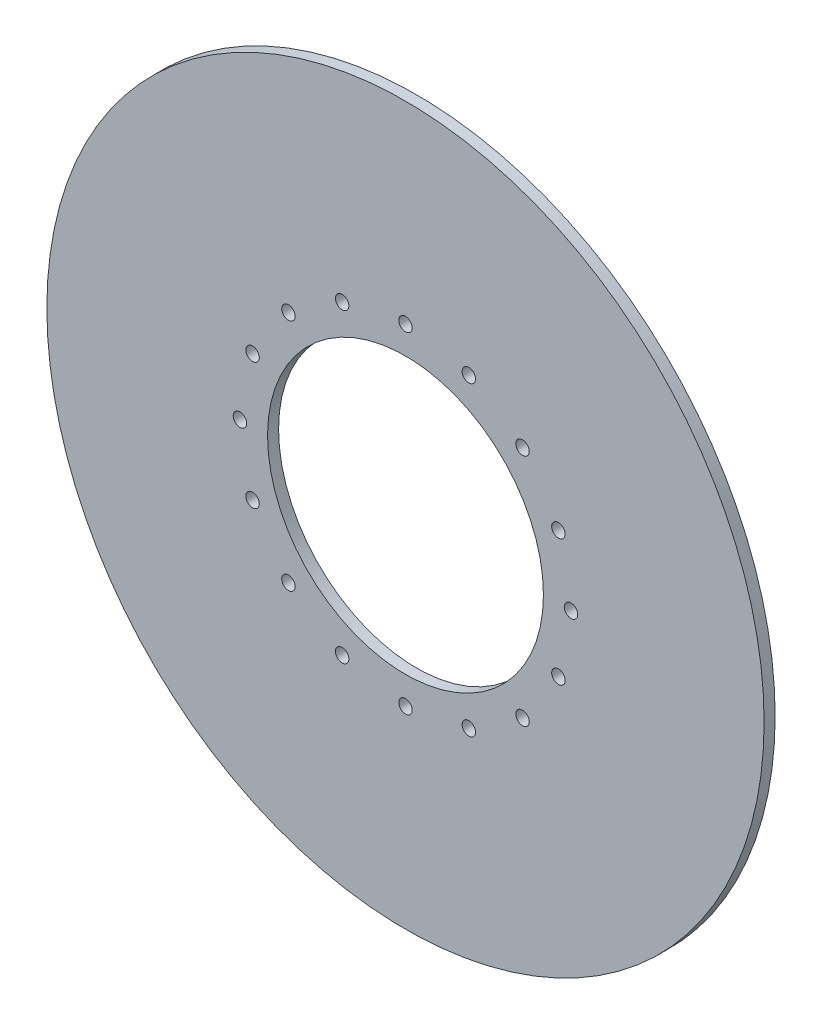
ISO-10303-21;
HEADER;
FILE_DESCRIPTION(('STEP AP214'),'2;1');
FILE_NAME('part.step','',(''),(''),'','','');
FILE_SCHEMA(('AUTOMOTIVE_DESIGN { 1 0 10303 214 1 1 1 1 }'));
ENDSEC;
DATA;
#1=APPLICATION_CONTEXT('core data for automotive mechanical design processes');
#2=APPLICATION_PROTOCOL_DEFINITION('international standard','automotive_design',2000,#1);
#3=PRODUCT_CONTEXT('',#1,'mechanical');
#4=PRODUCT('Part','Part','',(#3));
#5=PRODUCT_RELATED_PRODUCT_CATEGORY('part','',(#4));
#6=PRODUCT_DEFINITION_FORMATION('','',#4);
#7=PRODUCT_DEFINITION_CONTEXT('part definition',#1,'design');
#8=PRODUCT_DEFINITION('design','',#6,#7);
#9=PRODUCT_DEFINITION_SHAPE('','',#8);
#10=(LENGTH_UNIT() NAMED_UNIT(*) SI_UNIT(.MILLI.,.METRE.));
#11=(NAMED_UNIT(*) PLANE_ANGLE_UNIT() SI_UNIT($,.RADIAN.));
#12=(NAMED_UNIT(*) SI_UNIT($,.STERADIAN.) SOLID_ANGLE_UNIT());
#13=UNCERTAINTY_MEASURE_WITH_UNIT(LENGTH_MEASURE(1.E-05),#10,'distance_accuracy_value','');
#14=(GEOMETRIC_REPRESENTATION_CONTEXT(3) GLOBAL_UNCERTAINTY_ASSIGNED_CONTEXT((#13)) GLOBAL_UNIT_ASSIGNED_CONTEXT((#10,
#11,#12)) REPRESENTATION_CONTEXT('',''));
#15=CARTESIAN_POINT('',(0.,0.,0.));
#16=DIRECTION('',(0.,0.,1.));
#17=DIRECTION('',(1.,0.,0.));
#18=AXIS2_PLACEMENT_3D('',#15,#16,#17);
#19=CARTESIAN_POINT('',(0.,0.,10.));
#20=DIRECTION('',(0.,0.,1.));
#21=DIRECTION('',(1.,0.,0.));
#22=AXIS2_PLACEMENT_3D('',#19,#20,#21);
#23=PLANE('',#22);
#24=CARTESIAN_POINT('',(-106.066017177972,106.066017177958,10.));
#25=DIRECTION('',(0.,0.,1.));
#26=DIRECTION('',(1.,0.,0.));
#27=AXIS2_PLACEMENT_3D('',#24,#25,#26);
#28=CIRCLE('',#27,6.09999999999999);
#29=CARTESIAN_POINT('',(-99.966017177972,106.066017177958,10.));
#30=VERTEX_POINT('',#29);
#31=EDGE_CURVE('E132',#30,#30,#28,.T.);
#32=ORIENTED_EDGE('',*,*,#31,.F.);
#33=EDGE_LOOP('',(#32));
#34=FACE_BOUND('',#33,.T.);
#35=CARTESIAN_POINT('',(-149.999999999965,-3.4552222194506E-11,10.));
#36=DIRECTION('',(0.,0.,1.));
#37=DIRECTION('',(1.,0.,0.));
#38=AXIS2_PLACEMENT_3D('',#35,#36,#37);
#39=CIRCLE('',#38,6.09999999999998);
#40=CARTESIAN_POINT('',(-143.899999999965,-3.4552222194506E-11,10.));
#41=VERTEX_POINT('',#40);
#42=EDGE_CURVE('E120',#41,#41,#39,.T.);
#43=ORIENTED_EDGE('',*,*,#42,.F.);
#44=EDGE_LOOP('',(#43));
#45=FACE_BOUND('',#44,.T.);
#46=CARTESIAN_POINT('',(-106.066017177931,-106.066017178018,10.));
#47=DIRECTION('',(0.,0.,1.));
#48=DIRECTION('',(1.,0.,0.));
#49=AXIS2_PLACEMENT_3D('',#46,#47,#48);
#50=CIRCLE('',#49,6.09999999999999);
#51=CARTESIAN_POINT('',(-99.9660171779308,-106.066017178018,10.));
#52=VERTEX_POINT('',#51);
#53=EDGE_CURVE('E108',#52,#52,#50,.T.);
#54=ORIENTED_EDGE('',*,*,#53,.F.);
#55=EDGE_LOOP('',(#54));
#56=FACE_BOUND('',#55,.T.);
#57=CARTESIAN_POINT('',(6.6094680791334E-11,-150.000000000014,10.));
#58=DIRECTION('',(0.,0.,1.));
#59=DIRECTION('',(1.,0.,0.));
#60=AXIS2_PLACEMENT_3D('',#57,#58,#59);
#61=CIRCLE('',#60,6.1);
#62=CARTESIAN_POINT('',(6.10000000006609,-150.000000000014,10.));
#63=VERTEX_POINT('',#62);
#64=EDGE_CURVE('E96',#63,#63,#61,.T.);
#65=ORIENTED_EDGE('',*,*,#64,.F.);
#66=EDGE_LOOP('',(#65));
#67=FACE_BOUND('',#66,.T.);
#68=CARTESIAN_POINT('',(106.066017178044,-106.066017177971,10.));
#69=DIRECTION('',(0.,0.,1.));
#70=DIRECTION('',(1.,0.,0.));
#71=AXIS2_PLACEMENT_3D('',#68,#69,#70);
#72=CIRCLE('',#71,6.09999999999999);
#73=CARTESIAN_POINT('',(112.166017178044,-106.066017177971,10.));
#74=VERTEX_POINT('',#73);
#75=EDGE_CURVE('E84',#74,#74,#72,.T.);
#76=ORIENTED_EDGE('',*,*,#75,.F.);
#77=EDGE_LOOP('',(#76));
#78=FACE_BOUND('',#77,.T.);
#79=CARTESIAN_POINT('',(150.000000000035,3.45348749597463E-11,10.));
#80=DIRECTION('',(0.,0.,1.));
#81=DIRECTION('',(1.,0.,0.));
#82=AXIS2_PLACEMENT_3D('',#79,#80,#81);
#83=CIRCLE('',#82,6.09999999999998);
#84=CARTESIAN_POINT('',(156.100000000035,3.45348749597463E-11,10.));
#85=VERTEX_POINT('',#84);
#86=EDGE_CURVE('E72',#85,#85,#83,.T.);
#87=ORIENTED_EDGE('',*,*,#86,.F.);
#88=EDGE_LOOP('',(#87));
#89=FACE_BOUND('',#88,.T.);
#90=CARTESIAN_POINT('',(106.066017177992,106.066017178007,10.));
#91=DIRECTION('',(0.,0.,1.));
#92=DIRECTION('',(1.,0.,0.));
#93=AXIS2_PLACEMENT_3D('',#90,#91,#92);
#94=CIRCLE('',#93,6.09999999999999);
#95=CARTESIAN_POINT('',(112.166017177992,106.066017178007,10.));
#96=VERTEX_POINT('',#95);
#97=EDGE_CURVE('E60',#96,#96,#94,.T.);
#98=ORIENTED_EDGE('',*,*,#97,.F.);
#99=EDGE_LOOP('',(#98));
#100=FACE_BOUND('',#99,.T.);
#101=CARTESIAN_POINT('',(0.,150.,10.));
#102=DIRECTION('',(0.,0.,1.));
#103=DIRECTION('',(1.,0.,0.));
#104=AXIS2_PLACEMENT_3D('',#101,#102,#103);
#105=CIRCLE('',#104,6.09999999999999);
#106=CARTESIAN_POINT('',(6.09999999999999,150.,10.));
#107=VERTEX_POINT('',#106);
#108=EDGE_CURVE('E48',#107,#107,#105,.T.);
#109=ORIENTED_EDGE('',*,*,#108,.F.);
#110=EDGE_LOOP('',(#109));
#111=FACE_BOUND('',#110,.T.);
#112=CARTESIAN_POINT('',(0.,0.,10.));
#113=DIRECTION('',(0.,0.,1.));
#114=DIRECTION('',(1.,0.,0.));
#115=AXIS2_PLACEMENT_3D('',#112,#113,#114);
#116=CIRCLE('',#115,325.);
#117=CARTESIAN_POINT('',(325.,0.,10.));
#118=VERTEX_POINT('',#117);
#119=EDGE_CURVE('E10',#118,#118,#116,.T.);
#120=ORIENTED_EDGE('',*,*,#119,.T.);
#121=EDGE_LOOP('',(#120));
#122=FACE_BOUND('',#121,.T.);
#123=CARTESIAN_POINT('',(0.,0.,10.));
#124=DIRECTION('',(0.,0.,1.));
#125=DIRECTION('',(1.,0.,0.));
#126=AXIS2_PLACEMENT_3D('',#123,#124,#125);
#127=CIRCLE('',#126,125.);
#128=CARTESIAN_POINT('',(125.,0.,10.));
#129=VERTEX_POINT('',#128);
#130=EDGE_CURVE('E43',#129,#129,#127,.T.);
#131=ORIENTED_EDGE('',*,*,#130,.F.);
#132=EDGE_LOOP('',(#131));
#133=FACE_BOUND('',#132,.T.);
#134=CARTESIAN_POINT('',(57.402514854766,138.581929876706,10.));
#135=DIRECTION('',(0.,0.,1.));
#136=DIRECTION('',(1.,0.,0.));
#137=AXIS2_PLACEMENT_3D('',#134,#135,#136);
#138=CIRCLE('',#137,6.09999999999886);
#139=CARTESIAN_POINT('',(63.5025148547649,138.581929876706,10.));
#140=VERTEX_POINT('',#139);
#141=EDGE_CURVE('E54',#140,#140,#138,.T.);
#142=ORIENTED_EDGE('',*,*,#141,.F.);
#143=EDGE_LOOP('',(#142));
#144=FACE_BOUND('',#143,.T.);
#145=CARTESIAN_POINT('',(138.581929876714,57.4025148547954,10.));
#146=DIRECTION('',(0.,0.,1.));
#147=DIRECTION('',(1.,0.,0.));
#148=AXIS2_PLACEMENT_3D('',#145,#146,#147);
#149=CIRCLE('',#148,6.09999999999998);
#150=CARTESIAN_POINT('',(144.681929876714,57.4025148547954,10.));
#151=VERTEX_POINT('',#150);
#152=EDGE_CURVE('E66',#151,#151,#149,.T.);
#153=ORIENTED_EDGE('',*,*,#152,.F.);
#154=EDGE_LOOP('',(#153));
#155=FACE_BOUND('',#154,.T.);
#156=CARTESIAN_POINT('',(138.581929876745,-57.4025148547428,10.));
#157=DIRECTION('',(0.,0.,1.));
#158=DIRECTION('',(1.,0.,0.));
#159=AXIS2_PLACEMENT_3D('',#156,#157,#158);
#160=CIRCLE('',#159,6.09999999999998);
#161=CARTESIAN_POINT('',(144.681929876745,-57.4025148547428,10.));
#162=VERTEX_POINT('',#161);
#163=EDGE_CURVE('E78',#162,#162,#160,.T.);
#164=ORIENTED_EDGE('',*,*,#163,.F.);
#165=EDGE_LOOP('',(#164));
#166=FACE_BOUND('',#165,.T.);
#167=CARTESIAN_POINT('',(57.4025148548298,-138.581929876694,10.));
#168=DIRECTION('',(0.,0.,1.));
#169=DIRECTION('',(1.,0.,0.));
#170=AXIS2_PLACEMENT_3D('',#167,#168,#169);
#171=CIRCLE('',#170,6.09999999999999);
#172=CARTESIAN_POINT('',(63.5025148548298,-138.581929876694,10.));
#173=VERTEX_POINT('',#172);
#174=EDGE_CURVE('E90',#173,#173,#171,.T.);
#175=ORIENTED_EDGE('',*,*,#174,.F.);
#176=EDGE_LOOP('',(#175));
#177=FACE_BOUND('',#176,.T.);
#178=CARTESIAN_POINT('',(-57.4025148547026,-138.581929876719,10.));
#179=DIRECTION('',(0.,0.,1.));
#180=DIRECTION('',(1.,0.,0.));
#181=AXIS2_PLACEMENT_3D('',#178,#179,#180);
#182=CIRCLE('',#181,6.1);
#183=CARTESIAN_POINT('',(-51.3025148547026,-138.581929876719,10.));
#184=VERTEX_POINT('',#183);
#185=EDGE_CURVE('E102',#184,#184,#182,.T.);
#186=ORIENTED_EDGE('',*,*,#185,.F.);
#187=EDGE_LOOP('',(#186));
#188=FACE_BOUND('',#187,.T.);
#189=CARTESIAN_POINT('',(-138.581929876654,-57.4025148548039,10.));
#190=DIRECTION('',(0.,0.,1.));
#191=DIRECTION('',(1.,0.,0.));
#192=AXIS2_PLACEMENT_3D('',#189,#190,#191);
#193=CIRCLE('',#192,6.09999999999998);
#194=CARTESIAN_POINT('',(-132.481929876654,-57.4025148548039,10.));
#195=VERTEX_POINT('',#194);
#196=EDGE_CURVE('E114',#195,#195,#193,.T.);
#197=ORIENTED_EDGE('',*,*,#196,.F.);
#198=EDGE_LOOP('',(#197));
#199=FACE_BOUND('',#198,.T.);
#200=CARTESIAN_POINT('',(-138.581929876672,57.4025148547316,10.));
#201=DIRECTION('',(0.,0.,1.));
#202=DIRECTION('',(1.,0.,0.));
#203=AXIS2_PLACEMENT_3D('',#200,#201,#202);
#204=CIRCLE('',#203,6.09999999999998);
#205=CARTESIAN_POINT('',(-132.481929876672,57.4025148547316,10.));
#206=VERTEX_POINT('',#205);
#207=EDGE_CURVE('E126',#206,#206,#204,.T.);
#208=ORIENTED_EDGE('',*,*,#207,.F.);
#209=EDGE_LOOP('',(#208));
#210=FACE_BOUND('',#209,.T.);
#211=CARTESIAN_POINT('',(-57.4025148547638,138.58192987668,10.));
#212=DIRECTION('',(0.,0.,1.));
#213=DIRECTION('',(1.,0.,0.));
#214=AXIS2_PLACEMENT_3D('',#211,#212,#213);
#215=CIRCLE('',#214,6.10000000000001);
#216=CARTESIAN_POINT('',(-51.3025148547638,138.58192987668,10.));
#217=VERTEX_POINT('',#216);
#218=EDGE_CURVE('E138',#217,#217,#215,.T.);
#219=ORIENTED_EDGE('',*,*,#218,.F.);
#220=EDGE_LOOP('',(#219));
#221=FACE_BOUND('',#220,.T.);
#222=ADVANCED_FACE('F32',(#34,#45,#56,#67,#78,#89,#100,#111,#122,#133,#144,#155,#166,#177,#188,
#199,#210,#221),#23,.T.);
#223=CARTESIAN_POINT('',(0.,0.,0.));
#224=DIRECTION('',(0.,0.,1.));
#225=DIRECTION('',(1.,0.,0.));
#226=AXIS2_PLACEMENT_3D('',#223,#224,#225);
#227=PLANE('',#226);
#228=CARTESIAN_POINT('',(0.,0.,0.));
#229=DIRECTION('',(0.,0.,1.));
#230=DIRECTION('',(1.,0.,0.));
#231=AXIS2_PLACEMENT_3D('',#228,#229,#230);
#232=CIRCLE('',#231,325.);
#233=CARTESIAN_POINT('',(325.,0.,0.));
#234=VERTEX_POINT('',#233);
#235=EDGE_CURVE('E36',#234,#234,#232,.T.);
#236=ORIENTED_EDGE('',*,*,#235,.F.);
#237=EDGE_LOOP('',(#236));
#238=FACE_BOUND('',#237,.T.);
#239=CARTESIAN_POINT('',(0.,0.,0.));
#240=DIRECTION('',(0.,0.,1.));
#241=DIRECTION('',(1.,0.,0.));
#242=AXIS2_PLACEMENT_3D('',#239,#240,#241);
#243=CIRCLE('',#242,125.);
#244=CARTESIAN_POINT('',(125.,0.,0.));
#245=VERTEX_POINT('',#244);
#246=EDGE_CURVE('E45',#245,#245,#243,.T.);
#247=ORIENTED_EDGE('',*,*,#246,.T.);
#248=EDGE_LOOP('',(#247));
#249=FACE_BOUND('',#248,.T.);
#250=CARTESIAN_POINT('',(0.,150.,0.));
#251=DIRECTION('',(0.,0.,1.));
#252=DIRECTION('',(1.,0.,0.));
#253=AXIS2_PLACEMENT_3D('',#250,#251,#252);
#254=CIRCLE('',#253,6.09999999999999);
#255=CARTESIAN_POINT('',(6.09999999999999,150.,0.));
#256=VERTEX_POINT('',#255);
#257=EDGE_CURVE('E51',#256,#256,#254,.T.);
#258=ORIENTED_EDGE('',*,*,#257,.T.);
#259=EDGE_LOOP('',(#258));
#260=FACE_BOUND('',#259,.T.);
#261=CARTESIAN_POINT('',(57.402514854766,138.581929876706,0.));
#262=DIRECTION('',(0.,0.,1.));
#263=DIRECTION('',(1.,0.,0.));
#264=AXIS2_PLACEMENT_3D('',#261,#262,#263);
#265=CIRCLE('',#264,6.09999999999886);
#266=CARTESIAN_POINT('',(63.5025148547649,138.581929876706,0.));
#267=VERTEX_POINT('',#266);
#268=EDGE_CURVE('E57',#267,#267,#265,.T.);
#269=ORIENTED_EDGE('',*,*,#268,.T.);
#270=EDGE_LOOP('',(#269));
#271=FACE_BOUND('',#270,.T.);
#272=CARTESIAN_POINT('',(106.066017177992,106.066017178007,0.));
#273=DIRECTION('',(0.,0.,1.));
#274=DIRECTION('',(1.,0.,0.));
#275=AXIS2_PLACEMENT_3D('',#272,#273,#274);
#276=CIRCLE('',#275,6.09999999999999);
#277=CARTESIAN_POINT('',(112.166017177992,106.066017178007,0.));
#278=VERTEX_POINT('',#277);
#279=EDGE_CURVE('E63',#278,#278,#276,.T.);
#280=ORIENTED_EDGE('',*,*,#279,.T.);
#281=EDGE_LOOP('',(#280));
#282=FACE_BOUND('',#281,.T.);
#283=CARTESIAN_POINT('',(138.581929876714,57.4025148547954,0.));
#284=DIRECTION('',(0.,0.,1.));
#285=DIRECTION('',(1.,0.,0.));
#286=AXIS2_PLACEMENT_3D('',#283,#284,#285);
#287=CIRCLE('',#286,6.09999999999998);
#288=CARTESIAN_POINT('',(144.681929876714,57.4025148547954,0.));
#289=VERTEX_POINT('',#288);
#290=EDGE_CURVE('E69',#289,#289,#287,.T.);
#291=ORIENTED_EDGE('',*,*,#290,.T.);
#292=EDGE_LOOP('',(#291));
#293=FACE_BOUND('',#292,.T.);
#294=CARTESIAN_POINT('',(150.000000000035,3.45348749597463E-11,0.));
#295=DIRECTION('',(0.,0.,1.));
#296=DIRECTION('',(1.,0.,0.));
#297=AXIS2_PLACEMENT_3D('',#294,#295,#296);
#298=CIRCLE('',#297,6.09999999999998);
#299=CARTESIAN_POINT('',(156.100000000035,3.45348749597463E-11,0.));
#300=VERTEX_POINT('',#299);
#301=EDGE_CURVE('E75',#300,#300,#298,.T.);
#302=ORIENTED_EDGE('',*,*,#301,.T.);
#303=EDGE_LOOP('',(#302));
#304=FACE_BOUND('',#303,.T.);
#305=CARTESIAN_POINT('',(138.581929876745,-57.4025148547428,0.));
#306=DIRECTION('',(0.,0.,1.));
#307=DIRECTION('',(1.,0.,0.));
#308=AXIS2_PLACEMENT_3D('',#305,#306,#307);
#309=CIRCLE('',#308,6.09999999999998);
#310=CARTESIAN_POINT('',(144.681929876745,-57.4025148547428,0.));
#311=VERTEX_POINT('',#310);
#312=EDGE_CURVE('E81',#311,#311,#309,.T.);
#313=ORIENTED_EDGE('',*,*,#312,.T.);
#314=EDGE_LOOP('',(#313));
#315=FACE_BOUND('',#314,.T.);
#316=CARTESIAN_POINT('',(106.066017178044,-106.066017177971,0.));
#317=DIRECTION('',(0.,0.,1.));
#318=DIRECTION('',(1.,0.,0.));
#319=AXIS2_PLACEMENT_3D('',#316,#317,#318);
#320=CIRCLE('',#319,6.09999999999999);
#321=CARTESIAN_POINT('',(112.166017178044,-106.066017177971,0.));
#322=VERTEX_POINT('',#321);
#323=EDGE_CURVE('E87',#322,#322,#320,.T.);
#324=ORIENTED_EDGE('',*,*,#323,.T.);
#325=EDGE_LOOP('',(#324));
#326=FACE_BOUND('',#325,.T.);
#327=CARTESIAN_POINT('',(57.4025148548298,-138.581929876694,0.));
#328=DIRECTION('',(0.,0.,1.));
#329=DIRECTION('',(1.,0.,0.));
#330=AXIS2_PLACEMENT_3D('',#327,#328,#329);
#331=CIRCLE('',#330,6.09999999999999);
#332=CARTESIAN_POINT('',(63.5025148548298,-138.581929876694,0.));
#333=VERTEX_POINT('',#332);
#334=EDGE_CURVE('E93',#333,#333,#331,.T.);
#335=ORIENTED_EDGE('',*,*,#334,.T.);
#336=EDGE_LOOP('',(#335));
#337=FACE_BOUND('',#336,.T.);
#338=CARTESIAN_POINT('',(6.6094680791334E-11,-150.000000000014,0.));
#339=DIRECTION('',(0.,0.,1.));
#340=DIRECTION('',(1.,0.,0.));
#341=AXIS2_PLACEMENT_3D('',#338,#339,#340);
#342=CIRCLE('',#341,6.1);
#343=CARTESIAN_POINT('',(6.10000000006609,-150.000000000014,0.));
#344=VERTEX_POINT('',#343);
#345=EDGE_CURVE('E99',#344,#344,#342,.T.);
#346=ORIENTED_EDGE('',*,*,#345,.T.);
#347=EDGE_LOOP('',(#346));
#348=FACE_BOUND('',#347,.T.);
#349=CARTESIAN_POINT('',(-57.4025148547026,-138.581929876719,0.));
#350=DIRECTION('',(0.,0.,1.));
#351=DIRECTION('',(1.,0.,0.));
#352=AXIS2_PLACEMENT_3D('',#349,#350,#351);
#353=CIRCLE('',#352,6.1);
#354=CARTESIAN_POINT('',(-51.3025148547026,-138.581929876719,0.));
#355=VERTEX_POINT('',#354);
#356=EDGE_CURVE('E105',#355,#355,#353,.T.);
#357=ORIENTED_EDGE('',*,*,#356,.T.);
#358=EDGE_LOOP('',(#357));
#359=FACE_BOUND('',#358,.T.);
#360=CARTESIAN_POINT('',(-106.066017177931,-106.066017178018,0.));
#361=DIRECTION('',(0.,0.,1.));
#362=DIRECTION('',(1.,0.,0.));
#363=AXIS2_PLACEMENT_3D('',#360,#361,#362);
#364=CIRCLE('',#363,6.09999999999999);
#365=CARTESIAN_POINT('',(-99.9660171779308,-106.066017178018,0.));
#366=VERTEX_POINT('',#365);
#367=EDGE_CURVE('E111',#366,#366,#364,.T.);
#368=ORIENTED_EDGE('',*,*,#367,.T.);
#369=EDGE_LOOP('',(#368));
#370=FACE_BOUND('',#369,.T.);
#371=CARTESIAN_POINT('',(-138.581929876654,-57.4025148548039,0.));
#372=DIRECTION('',(0.,0.,1.));
#373=DIRECTION('',(1.,0.,0.));
#374=AXIS2_PLACEMENT_3D('',#371,#372,#373);
#375=CIRCLE('',#374,6.09999999999998);
#376=CARTESIAN_POINT('',(-132.481929876654,-57.4025148548039,0.));
#377=VERTEX_POINT('',#376);
#378=EDGE_CURVE('E117',#377,#377,#375,.T.);
#379=ORIENTED_EDGE('',*,*,#378,.T.);
#380=EDGE_LOOP('',(#379));
#381=FACE_BOUND('',#380,.T.);
#382=CARTESIAN_POINT('',(-149.999999999965,-3.4552222194506E-11,0.));
#383=DIRECTION('',(0.,0.,1.));
#384=DIRECTION('',(1.,0.,0.));
#385=AXIS2_PLACEMENT_3D('',#382,#383,#384);
#386=CIRCLE('',#385,6.09999999999998);
#387=CARTESIAN_POINT('',(-143.899999999965,-3.4552222194506E-11,0.));
#388=VERTEX_POINT('',#387);
#389=EDGE_CURVE('E123',#388,#388,#386,.T.);
#390=ORIENTED_EDGE('',*,*,#389,.T.);
#391=EDGE_LOOP('',(#390));
#392=FACE_BOUND('',#391,.T.);
#393=CARTESIAN_POINT('',(-138.581929876672,57.4025148547316,0.));
#394=DIRECTION('',(0.,0.,1.));
#395=DIRECTION('',(1.,0.,0.));
#396=AXIS2_PLACEMENT_3D('',#393,#394,#395);
#397=CIRCLE('',#396,6.09999999999998);
#398=CARTESIAN_POINT('',(-132.481929876672,57.4025148547316,0.));
#399=VERTEX_POINT('',#398);
#400=EDGE_CURVE('E129',#399,#399,#397,.T.);
#401=ORIENTED_EDGE('',*,*,#400,.T.);
#402=EDGE_LOOP('',(#401));
#403=FACE_BOUND('',#402,.T.);
#404=CARTESIAN_POINT('',(-106.066017177972,106.066017177958,0.));
#405=DIRECTION('',(0.,0.,1.));
#406=DIRECTION('',(1.,0.,0.));
#407=AXIS2_PLACEMENT_3D('',#404,#405,#406);
#408=CIRCLE('',#407,6.09999999999999);
#409=CARTESIAN_POINT('',(-99.966017177972,106.066017177958,0.));
#410=VERTEX_POINT('',#409);
#411=EDGE_CURVE('E135',#410,#410,#408,.T.);
#412=ORIENTED_EDGE('',*,*,#411,.T.);
#413=EDGE_LOOP('',(#412));
#414=FACE_BOUND('',#413,.T.);
#415=CARTESIAN_POINT('',(-57.4025148547638,138.58192987668,0.));
#416=DIRECTION('',(0.,0.,1.));
#417=DIRECTION('',(1.,0.,0.));
#418=AXIS2_PLACEMENT_3D('',#415,#416,#417);
#419=CIRCLE('',#418,6.10000000000001);
#420=CARTESIAN_POINT('',(-51.3025148547638,138.58192987668,0.));
#421=VERTEX_POINT('',#420);
#422=EDGE_CURVE('E141',#421,#421,#419,.T.);
#423=ORIENTED_EDGE('',*,*,#422,.T.);
#424=EDGE_LOOP('',(#423));
#425=FACE_BOUND('',#424,.T.);
#426=ADVANCED_FACE('F151',(#238,#249,#260,#271,#282,#293,#304,#315,#326,#337,#348,#359,#370,
#381,#392,#403,#414,#425),#227,.F.);
#427=CARTESIAN_POINT('',(0.,0.,10.));
#428=DIRECTION('',(0.,0.,-1.));
#429=DIRECTION('',(-1.,0.,0.));
#430=AXIS2_PLACEMENT_3D('',#427,#428,#429);
#431=CYLINDRICAL_SURFACE('',#430,325.);
#432=ORIENTED_EDGE('',*,*,#119,.F.);
#433=EDGE_LOOP('',(#432));
#434=FACE_BOUND('',#433,.T.);
#435=ORIENTED_EDGE('',*,*,#235,.T.);
#436=EDGE_LOOP('',(#435));
#437=FACE_BOUND('',#436,.T.);
#438=ADVANCED_FACE('F34',(#434,#437),#431,.T.);
#439=CARTESIAN_POINT('',(0.,0.,10.));
#440=DIRECTION('',(0.,0.,-1.));
#441=DIRECTION('',(-1.,0.,0.));
#442=AXIS2_PLACEMENT_3D('',#439,#440,#441);
#443=CYLINDRICAL_SURFACE('',#442,125.);
#444=ORIENTED_EDGE('',*,*,#130,.T.);
#445=EDGE_LOOP('',(#444));
#446=FACE_BOUND('',#445,.T.);
#447=ORIENTED_EDGE('',*,*,#246,.F.);
#448=EDGE_LOOP('',(#447));
#449=FACE_BOUND('',#448,.T.);
#450=ADVANCED_FACE('F161',(#446,#449),#443,.F.);
#451=CARTESIAN_POINT('',(0.,150.,10.));
#452=DIRECTION('',(0.,0.,-1.));
#453=DIRECTION('',(-1.,0.,0.));
#454=AXIS2_PLACEMENT_3D('',#451,#452,#453);
#455=CYLINDRICAL_SURFACE('',#454,6.09999999999999);
#456=ORIENTED_EDGE('',*,*,#108,.T.);
#457=EDGE_LOOP('',(#456));
#458=FACE_BOUND('',#457,.T.);
#459=ORIENTED_EDGE('',*,*,#257,.F.);
#460=EDGE_LOOP('',(#459));
#461=FACE_BOUND('',#460,.T.);
#462=ADVANCED_FACE('F164',(#458,#461),#455,.F.);
#463=CARTESIAN_POINT('',(57.402514854766,138.581929876706,10.));
#464=DIRECTION('',(0.,0.,-1.));
#465=DIRECTION('',(-1.,0.,0.));
#466=AXIS2_PLACEMENT_3D('',#463,#464,#465);
#467=CYLINDRICAL_SURFACE('',#466,6.09999999999886);
#468=ORIENTED_EDGE('',*,*,#141,.T.);
#469=EDGE_LOOP('',(#468));
#470=FACE_BOUND('',#469,.T.);
#471=ORIENTED_EDGE('',*,*,#268,.F.);
#472=EDGE_LOOP('',(#471));
#473=FACE_BOUND('',#472,.T.);
#474=ADVANCED_FACE('F168',(#470,#473),#467,.F.);
#475=CARTESIAN_POINT('',(106.066017177992,106.066017178007,10.));
#476=DIRECTION('',(0.,0.,-1.));
#477=DIRECTION('',(-1.,0.,0.));
#478=AXIS2_PLACEMENT_3D('',#475,#476,#477);
#479=CYLINDRICAL_SURFACE('',#478,6.09999999999999);
#480=ORIENTED_EDGE('',*,*,#97,.T.);
#481=EDGE_LOOP('',(#480));
#482=FACE_BOUND('',#481,.T.);
#483=ORIENTED_EDGE('',*,*,#279,.F.);
#484=EDGE_LOOP('',(#483));
#485=FACE_BOUND('',#484,.T.);
#486=ADVANCED_FACE('F172',(#482,#485),#479,.F.);
#487=CARTESIAN_POINT('',(138.581929876714,57.4025148547954,10.));
#488=DIRECTION('',(0.,0.,-1.));
#489=DIRECTION('',(-1.,0.,0.));
#490=AXIS2_PLACEMENT_3D('',#487,#488,#489);
#491=CYLINDRICAL_SURFACE('',#490,6.09999999999998);
#492=ORIENTED_EDGE('',*,*,#152,.T.);
#493=EDGE_LOOP('',(#492));
#494=FACE_BOUND('',#493,.T.);
#495=ORIENTED_EDGE('',*,*,#290,.F.);
#496=EDGE_LOOP('',(#495));
#497=FACE_BOUND('',#496,.T.);
#498=ADVANCED_FACE('F176',(#494,#497),#491,.F.);
#499=CARTESIAN_POINT('',(150.000000000035,3.45348749597463E-11,10.));
#500=DIRECTION('',(0.,0.,-1.));
#501=DIRECTION('',(-1.,0.,0.));
#502=AXIS2_PLACEMENT_3D('',#499,#500,#501);
#503=CYLINDRICAL_SURFACE('',#502,6.09999999999998);
#504=ORIENTED_EDGE('',*,*,#86,.T.);
#505=EDGE_LOOP('',(#504));
#506=FACE_BOUND('',#505,.T.);
#507=ORIENTED_EDGE('',*,*,#301,.F.);
#508=EDGE_LOOP('',(#507));
#509=FACE_BOUND('',#508,.T.);
#510=ADVANCED_FACE('F180',(#506,#509),#503,.F.);
#511=CARTESIAN_POINT('',(138.581929876745,-57.4025148547428,10.));
#512=DIRECTION('',(0.,0.,-1.));
#513=DIRECTION('',(-1.,0.,0.));
#514=AXIS2_PLACEMENT_3D('',#511,#512,#513);
#515=CYLINDRICAL_SURFACE('',#514,6.09999999999998);
#516=ORIENTED_EDGE('',*,*,#163,.T.);
#517=EDGE_LOOP('',(#516));
#518=FACE_BOUND('',#517,.T.);
#519=ORIENTED_EDGE('',*,*,#312,.F.);
#520=EDGE_LOOP('',(#519));
#521=FACE_BOUND('',#520,.T.);
#522=ADVANCED_FACE('F184',(#518,#521),#515,.F.);
#523=CARTESIAN_POINT('',(106.066017178044,-106.066017177971,10.));
#524=DIRECTION('',(0.,0.,-1.));
#525=DIRECTION('',(-1.,0.,0.));
#526=AXIS2_PLACEMENT_3D('',#523,#524,#525);
#527=CYLINDRICAL_SURFACE('',#526,6.09999999999999);
#528=ORIENTED_EDGE('',*,*,#75,.T.);
#529=EDGE_LOOP('',(#528));
#530=FACE_BOUND('',#529,.T.);
#531=ORIENTED_EDGE('',*,*,#323,.F.);
#532=EDGE_LOOP('',(#531));
#533=FACE_BOUND('',#532,.T.);
#534=ADVANCED_FACE('F188',(#530,#533),#527,.F.);
#535=CARTESIAN_POINT('',(57.4025148548298,-138.581929876694,10.));
#536=DIRECTION('',(0.,0.,-1.));
#537=DIRECTION('',(-1.,0.,0.));
#538=AXIS2_PLACEMENT_3D('',#535,#536,#537);
#539=CYLINDRICAL_SURFACE('',#538,6.09999999999999);
#540=ORIENTED_EDGE('',*,*,#174,.T.);
#541=EDGE_LOOP('',(#540));
#542=FACE_BOUND('',#541,.T.);
#543=ORIENTED_EDGE('',*,*,#334,.F.);
#544=EDGE_LOOP('',(#543));
#545=FACE_BOUND('',#544,.T.);
#546=ADVANCED_FACE('F192',(#542,#545),#539,.F.);
#547=CARTESIAN_POINT('',(6.6094680791334E-11,-150.000000000014,10.));
#548=DIRECTION('',(0.,0.,-1.));
#549=DIRECTION('',(-1.,0.,0.));
#550=AXIS2_PLACEMENT_3D('',#547,#548,#549);
#551=CYLINDRICAL_SURFACE('',#550,6.1);
#552=ORIENTED_EDGE('',*,*,#64,.T.);
#553=EDGE_LOOP('',(#552));
#554=FACE_BOUND('',#553,.T.);
#555=ORIENTED_EDGE('',*,*,#345,.F.);
#556=EDGE_LOOP('',(#555));
#557=FACE_BOUND('',#556,.T.);
#558=ADVANCED_FACE('F196',(#554,#557),#551,.F.);
#559=CARTESIAN_POINT('',(-57.4025148547026,-138.581929876719,10.));
#560=DIRECTION('',(0.,0.,-1.));
#561=DIRECTION('',(-1.,0.,0.));
#562=AXIS2_PLACEMENT_3D('',#559,#560,#561);
#563=CYLINDRICAL_SURFACE('',#562,6.1);
#564=ORIENTED_EDGE('',*,*,#185,.T.);
#565=EDGE_LOOP('',(#564));
#566=FACE_BOUND('',#565,.T.);
#567=ORIENTED_EDGE('',*,*,#356,.F.);
#568=EDGE_LOOP('',(#567));
#569=FACE_BOUND('',#568,.T.);
#570=ADVANCED_FACE('F200',(#566,#569),#563,.F.);
#571=CARTESIAN_POINT('',(-106.066017177931,-106.066017178018,10.));
#572=DIRECTION('',(0.,0.,-1.));
#573=DIRECTION('',(-1.,0.,0.));
#574=AXIS2_PLACEMENT_3D('',#571,#572,#573);
#575=CYLINDRICAL_SURFACE('',#574,6.09999999999999);
#576=ORIENTED_EDGE('',*,*,#53,.T.);
#577=EDGE_LOOP('',(#576));
#578=FACE_BOUND('',#577,.T.);
#579=ORIENTED_EDGE('',*,*,#367,.F.);
#580=EDGE_LOOP('',(#579));
#581=FACE_BOUND('',#580,.T.);
#582=ADVANCED_FACE('F204',(#578,#581),#575,.F.);
#583=CARTESIAN_POINT('',(-138.581929876654,-57.4025148548039,10.));
#584=DIRECTION('',(0.,0.,-1.));
#585=DIRECTION('',(-1.,0.,0.));
#586=AXIS2_PLACEMENT_3D('',#583,#584,#585);
#587=CYLINDRICAL_SURFACE('',#586,6.09999999999998);
#588=ORIENTED_EDGE('',*,*,#196,.T.);
#589=EDGE_LOOP('',(#588));
#590=FACE_BOUND('',#589,.T.);
#591=ORIENTED_EDGE('',*,*,#378,.F.);
#592=EDGE_LOOP('',(#591));
#593=FACE_BOUND('',#592,.T.);
#594=ADVANCED_FACE('F208',(#590,#593),#587,.F.);
#595=CARTESIAN_POINT('',(-149.999999999965,-3.4552222194506E-11,10.));
#596=DIRECTION('',(0.,0.,-1.));
#597=DIRECTION('',(-1.,0.,0.));
#598=AXIS2_PLACEMENT_3D('',#595,#596,#597);
#599=CYLINDRICAL_SURFACE('',#598,6.09999999999998);
#600=ORIENTED_EDGE('',*,*,#42,.T.);
#601=EDGE_LOOP('',(#600));
#602=FACE_BOUND('',#601,.T.);
#603=ORIENTED_EDGE('',*,*,#389,.F.);
#604=EDGE_LOOP('',(#603));
#605=FACE_BOUND('',#604,.T.);
#606=ADVANCED_FACE('F212',(#602,#605),#599,.F.);
#607=CARTESIAN_POINT('',(-138.581929876672,57.4025148547316,10.));
#608=DIRECTION('',(0.,0.,-1.));
#609=DIRECTION('',(-1.,0.,0.));
#610=AXIS2_PLACEMENT_3D('',#607,#608,#609);
#611=CYLINDRICAL_SURFACE('',#610,6.09999999999998);
#612=ORIENTED_EDGE('',*,*,#207,.T.);
#613=EDGE_LOOP('',(#612));
#614=FACE_BOUND('',#613,.T.);
#615=ORIENTED_EDGE('',*,*,#400,.F.);
#616=EDGE_LOOP('',(#615));
#617=FACE_BOUND('',#616,.T.);
#618=ADVANCED_FACE('F216',(#614,#617),#611,.F.);
#619=CARTESIAN_POINT('',(-106.066017177972,106.066017177958,10.));
#620=DIRECTION('',(0.,0.,-1.));
#621=DIRECTION('',(-1.,0.,0.));
#622=AXIS2_PLACEMENT_3D('',#619,#620,#621);
#623=CYLINDRICAL_SURFACE('',#622,6.09999999999999);
#624=ORIENTED_EDGE('',*,*,#31,.T.);
#625=EDGE_LOOP('',(#624));
#626=FACE_BOUND('',#625,.T.);
#627=ORIENTED_EDGE('',*,*,#411,.F.);
#628=EDGE_LOOP('',(#627));
#629=FACE_BOUND('',#628,.T.);
#630=ADVANCED_FACE('F220',(#626,#629),#623,.F.);
#631=CARTESIAN_POINT('',(-57.4025148547638,138.58192987668,10.));
#632=DIRECTION('',(0.,0.,-1.));
#633=DIRECTION('',(-1.,0.,0.));
#634=AXIS2_PLACEMENT_3D('',#631,#632,#633);
#635=CYLINDRICAL_SURFACE('',#634,6.10000000000001);
#636=ORIENTED_EDGE('',*,*,#218,.T.);
#637=EDGE_LOOP('',(#636));
#638=FACE_BOUND('',#637,.T.);
#639=ORIENTED_EDGE('',*,*,#422,.F.);
#640=EDGE_LOOP('',(#639));
#641=FACE_BOUND('',#640,.T.);
#642=ADVANCED_FACE('F147',(#638,#641),#635,.F.);
#643=CLOSED_SHELL('',(#222,#426,#438,#450,#462,#474,#486,#498,#510,#522,#534,#546,#558,#570,
#582,#594,#606,#618,#630,#642));
#644=MANIFOLD_SOLID_BREP('B2',#643);
#645=ADVANCED_BREP_SHAPE_REPRESENTATION('',(#18,#644),#14);
#646=SHAPE_DEFINITION_REPRESENTATION(#9,#645);
ENDSEC;
END-ISO-10303-21;
